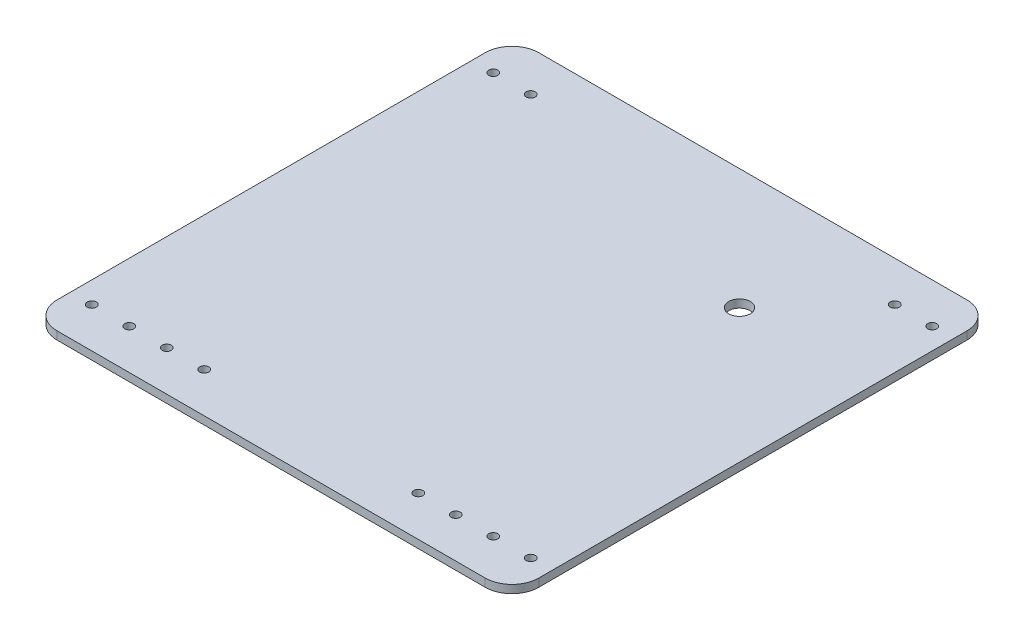
ISO-10303-21;
HEADER;
FILE_DESCRIPTION(('STEP AP214'),'2;1');
FILE_NAME('part.step','',(''),(''),'','','');
FILE_SCHEMA(('AUTOMOTIVE_DESIGN { 1 0 10303 214 1 1 1 1 }'));
ENDSEC;
DATA;
#1=APPLICATION_CONTEXT('core data for automotive mechanical design processes');
#2=APPLICATION_PROTOCOL_DEFINITION('international standard','automotive_design',2000,#1);
#3=PRODUCT_CONTEXT('',#1,'mechanical');
#4=PRODUCT('Part','Part','',(#3));
#5=PRODUCT_RELATED_PRODUCT_CATEGORY('part','',(#4));
#6=PRODUCT_DEFINITION_FORMATION('','',#4);
#7=PRODUCT_DEFINITION_CONTEXT('part definition',#1,'design');
#8=PRODUCT_DEFINITION('design','',#6,#7);
#9=PRODUCT_DEFINITION_SHAPE('','',#8);
#10=(LENGTH_UNIT() NAMED_UNIT(*) SI_UNIT(.MILLI.,.METRE.));
#11=(NAMED_UNIT(*) PLANE_ANGLE_UNIT() SI_UNIT($,.RADIAN.));
#12=(NAMED_UNIT(*) SI_UNIT($,.STERADIAN.) SOLID_ANGLE_UNIT());
#13=UNCERTAINTY_MEASURE_WITH_UNIT(LENGTH_MEASURE(1.E-05),#10,'distance_accuracy_value','');
#14=(GEOMETRIC_REPRESENTATION_CONTEXT(3) GLOBAL_UNCERTAINTY_ASSIGNED_CONTEXT((#13)) GLOBAL_UNIT_ASSIGNED_CONTEXT((#10,
#11,#12)) REPRESENTATION_CONTEXT('',''));
#15=CARTESIAN_POINT('',(0.,0.,0.));
#16=DIRECTION('',(0.,0.,1.));
#17=DIRECTION('',(1.,0.,0.));
#18=AXIS2_PLACEMENT_3D('',#15,#16,#17);
#19=CARTESIAN_POINT('',(90.,3.,-90.));
#20=DIRECTION('',(-1.,0.,0.));
#21=DIRECTION('',(0.,0.,1.));
#22=AXIS2_PLACEMENT_3D('',#19,#20,#21);
#23=PLANE('',#22);
#24=DIRECTION('',(0.,0.,-1.));
#25=VECTOR('',#24,1.);
#26=CARTESIAN_POINT('',(90.,0.,-90.));
#27=LINE('',#26,#25);
#28=CARTESIAN_POINT('',(90.,0.,79.9999999999999));
#29=VERTEX_POINT('',#28);
#30=CARTESIAN_POINT('',(90.,0.,-80.));
#31=VERTEX_POINT('',#30);
#32=EDGE_CURVE('E129',#29,#31,#27,.T.);
#33=ORIENTED_EDGE('',*,*,#32,.T.);
#34=DIRECTION('',(0.,-1.,0.));
#35=VECTOR('',#34,1.);
#36=CARTESIAN_POINT('',(90.,3.,-80.));
#37=LINE('',#36,#35);
#38=CARTESIAN_POINT('',(90.,3.,-80.));
#39=VERTEX_POINT('',#38);
#40=EDGE_CURVE('E11',#31,#39,#37,.F.);
#41=ORIENTED_EDGE('',*,*,#40,.T.);
#42=DIRECTION('',(0.,0.,-1.));
#43=VECTOR('',#42,1.);
#44=CARTESIAN_POINT('',(90.,3.,-90.));
#45=LINE('',#44,#43);
#46=CARTESIAN_POINT('',(90.,3.,79.9999999999999));
#47=VERTEX_POINT('',#46);
#48=EDGE_CURVE('E127',#47,#39,#45,.T.);
#49=ORIENTED_EDGE('',*,*,#48,.F.);
#50=DIRECTION('',(0.,-1.,0.));
#51=VECTOR('',#50,1.);
#52=CARTESIAN_POINT('',(90.,3.,80.));
#53=LINE('',#52,#51);
#54=EDGE_CURVE('E41',#47,#29,#53,.T.);
#55=ORIENTED_EDGE('',*,*,#54,.T.);
#56=EDGE_LOOP('',(#33,#41,#49,#55));
#57=FACE_BOUND('',#56,.T.);
#58=ADVANCED_FACE('F33',(#57),#23,.F.);
#59=CARTESIAN_POINT('',(-90.,3.,-90.));
#60=DIRECTION('',(0.,0.,1.));
#61=DIRECTION('',(1.,0.,0.));
#62=AXIS2_PLACEMENT_3D('',#59,#60,#61);
#63=PLANE('',#62);
#64=DIRECTION('',(-1.,0.,0.));
#65=VECTOR('',#64,1.);
#66=CARTESIAN_POINT('',(-90.,0.,-90.));
#67=LINE('',#66,#65);
#68=CARTESIAN_POINT('',(79.9999999999999,0.,-90.));
#69=VERTEX_POINT('',#68);
#70=CARTESIAN_POINT('',(-80.,0.,-90.));
#71=VERTEX_POINT('',#70);
#72=EDGE_CURVE('E125',#69,#71,#67,.T.);
#73=ORIENTED_EDGE('',*,*,#72,.T.);
#74=DIRECTION('',(0.,-1.,0.));
#75=VECTOR('',#74,1.);
#76=CARTESIAN_POINT('',(-80.,3.,-90.));
#77=LINE('',#76,#75);
#78=CARTESIAN_POINT('',(-80.,3.,-90.));
#79=VERTEX_POINT('',#78);
#80=EDGE_CURVE('E104',#71,#79,#77,.F.);
#81=ORIENTED_EDGE('',*,*,#80,.T.);
#82=DIRECTION('',(-1.,0.,0.));
#83=VECTOR('',#82,1.);
#84=CARTESIAN_POINT('',(-90.,3.,-90.));
#85=LINE('',#84,#83);
#86=CARTESIAN_POINT('',(79.9999999999999,3.,-90.));
#87=VERTEX_POINT('',#86);
#88=EDGE_CURVE('E169',#87,#79,#85,.T.);
#89=ORIENTED_EDGE('',*,*,#88,.F.);
#90=DIRECTION('',(0.,-1.,0.));
#91=VECTOR('',#90,1.);
#92=CARTESIAN_POINT('',(80.,3.,-90.));
#93=LINE('',#92,#91);
#94=EDGE_CURVE('E109',#87,#69,#93,.T.);
#95=ORIENTED_EDGE('',*,*,#94,.T.);
#96=EDGE_LOOP('',(#73,#81,#89,#95));
#97=FACE_BOUND('',#96,.T.);
#98=ADVANCED_FACE('F289',(#97),#63,.F.);
#99=CARTESIAN_POINT('',(-90.,3.,-90.));
#100=DIRECTION('',(1.,0.,0.));
#101=DIRECTION('',(0.,0.,-1.));
#102=AXIS2_PLACEMENT_3D('',#99,#100,#101);
#103=PLANE('',#102);
#104=DIRECTION('',(0.,0.,1.));
#105=VECTOR('',#104,1.);
#106=CARTESIAN_POINT('',(-90.,3.,-90.));
#107=LINE('',#106,#105);
#108=CARTESIAN_POINT('',(-90.,3.,-80.));
#109=VERTEX_POINT('',#108);
#110=CARTESIAN_POINT('',(-90.,3.,79.9999999999999));
#111=VERTEX_POINT('',#110);
#112=EDGE_CURVE('E118',#109,#111,#107,.T.);
#113=ORIENTED_EDGE('',*,*,#112,.F.);
#114=DIRECTION('',(0.,-1.,0.));
#115=VECTOR('',#114,1.);
#116=CARTESIAN_POINT('',(-90.,3.,-80.));
#117=LINE('',#116,#115);
#118=CARTESIAN_POINT('',(-90.,0.,-80.));
#119=VERTEX_POINT('',#118);
#120=EDGE_CURVE('E103',#109,#119,#117,.T.);
#121=ORIENTED_EDGE('',*,*,#120,.T.);
#122=DIRECTION('',(0.,0.,1.));
#123=VECTOR('',#122,1.);
#124=CARTESIAN_POINT('',(-90.,0.,-90.));
#125=LINE('',#124,#123);
#126=CARTESIAN_POINT('',(-90.,0.,79.9999999999999));
#127=VERTEX_POINT('',#126);
#128=EDGE_CURVE('E116',#119,#127,#125,.T.);
#129=ORIENTED_EDGE('',*,*,#128,.T.);
#130=DIRECTION('',(0.,-1.,0.));
#131=VECTOR('',#130,1.);
#132=CARTESIAN_POINT('',(-90.,3.,80.));
#133=LINE('',#132,#131);
#134=EDGE_CURVE('E120',#127,#111,#133,.F.);
#135=ORIENTED_EDGE('',*,*,#134,.T.);
#136=EDGE_LOOP('',(#113,#121,#129,#135));
#137=FACE_BOUND('',#136,.T.);
#138=ADVANCED_FACE('F115',(#137),#103,.F.);
#139=CARTESIAN_POINT('',(-90.,3.,90.));
#140=DIRECTION('',(0.,0.,-1.));
#141=DIRECTION('',(-1.,0.,0.));
#142=AXIS2_PLACEMENT_3D('',#139,#140,#141);
#143=PLANE('',#142);
#144=DIRECTION('',(1.,0.,0.));
#145=VECTOR('',#144,1.);
#146=CARTESIAN_POINT('',(-90.,3.,90.));
#147=LINE('',#146,#145);
#148=CARTESIAN_POINT('',(-80.,3.,90.));
#149=VERTEX_POINT('',#148);
#150=CARTESIAN_POINT('',(79.9999999999999,3.,90.));
#151=VERTEX_POINT('',#150);
#152=EDGE_CURVE('E133',#149,#151,#147,.T.);
#153=ORIENTED_EDGE('',*,*,#152,.F.);
#154=DIRECTION('',(0.,-1.,0.));
#155=VECTOR('',#154,1.);
#156=CARTESIAN_POINT('',(-80.,3.,90.));
#157=LINE('',#156,#155);
#158=CARTESIAN_POINT('',(-80.,0.,90.));
#159=VERTEX_POINT('',#158);
#160=EDGE_CURVE('E150',#149,#159,#157,.T.);
#161=ORIENTED_EDGE('',*,*,#160,.T.);
#162=DIRECTION('',(1.,0.,0.));
#163=VECTOR('',#162,1.);
#164=CARTESIAN_POINT('',(-90.,0.,90.));
#165=LINE('',#164,#163);
#166=CARTESIAN_POINT('',(79.9999999999999,0.,90.));
#167=VERTEX_POINT('',#166);
#168=EDGE_CURVE('E124',#159,#167,#165,.T.);
#169=ORIENTED_EDGE('',*,*,#168,.T.);
#170=DIRECTION('',(0.,-1.,0.));
#171=VECTOR('',#170,1.);
#172=CARTESIAN_POINT('',(80.,3.,90.));
#173=LINE('',#172,#171);
#174=EDGE_CURVE('E48',#167,#151,#173,.F.);
#175=ORIENTED_EDGE('',*,*,#174,.T.);
#176=EDGE_LOOP('',(#153,#161,#169,#175));
#177=FACE_BOUND('',#176,.T.);
#178=ADVANCED_FACE('F260',(#177),#143,.F.);
#179=CARTESIAN_POINT('',(0.,3.,0.));
#180=DIRECTION('',(0.,1.,0.));
#181=DIRECTION('',(0.,0.,1.));
#182=AXIS2_PLACEMENT_3D('',#179,#180,#181);
#183=PLANE('',#182);
#184=CARTESIAN_POINT('',(40.,3.,-45.));
#185=DIRECTION('',(0.,1.,0.));
#186=DIRECTION('',(0.,0.,1.));
#187=AXIS2_PLACEMENT_3D('',#184,#185,#186);
#188=CIRCLE('',#187,4.);
#189=CARTESIAN_POINT('',(40.,3.,-41.));
#190=VERTEX_POINT('',#189);
#191=EDGE_CURVE('E242',#190,#190,#188,.T.);
#192=ORIENTED_EDGE('',*,*,#191,.F.);
#193=EDGE_LOOP('',(#192));
#194=FACE_BOUND('',#193,.T.);
#195=CARTESIAN_POINT('',(-68.,3.,75.));
#196=DIRECTION('',(0.,1.,0.));
#197=DIRECTION('',(0.,0.,1.));
#198=AXIS2_PLACEMENT_3D('',#195,#196,#197);
#199=CIRCLE('',#198,1.70000000000001);
#200=CARTESIAN_POINT('',(-68.,3.,76.7));
#201=VERTEX_POINT('',#200);
#202=EDGE_CURVE('E203',#201,#201,#199,.T.);
#203=ORIENTED_EDGE('',*,*,#202,.F.);
#204=EDGE_LOOP('',(#203));
#205=FACE_BOUND('',#204,.T.);
#206=CARTESIAN_POINT('',(68.,3.,75.));
#207=DIRECTION('',(0.,1.,0.));
#208=DIRECTION('',(0.,0.,1.));
#209=AXIS2_PLACEMENT_3D('',#206,#207,#208);
#210=CIRCLE('',#209,1.70000000000001);
#211=CARTESIAN_POINT('',(68.,3.,76.7));
#212=VERTEX_POINT('',#211);
#213=EDGE_CURVE('E204',#212,#212,#210,.T.);
#214=ORIENTED_EDGE('',*,*,#213,.F.);
#215=EDGE_LOOP('',(#214));
#216=FACE_BOUND('',#215,.T.);
#217=CARTESIAN_POINT('',(82.,3.,75.));
#218=DIRECTION('',(0.,1.,0.));
#219=DIRECTION('',(0.,0.,1.));
#220=AXIS2_PLACEMENT_3D('',#217,#218,#219);
#221=CIRCLE('',#220,1.70000000000001);
#222=CARTESIAN_POINT('',(82.,3.,76.7));
#223=VERTEX_POINT('',#222);
#224=EDGE_CURVE('E215',#223,#223,#221,.T.);
#225=ORIENTED_EDGE('',*,*,#224,.F.);
#226=EDGE_LOOP('',(#225));
#227=FACE_BOUND('',#226,.T.);
#228=CARTESIAN_POINT('',(-54.,3.,75.));
#229=DIRECTION('',(0.,1.,0.));
#230=DIRECTION('',(0.,0.,1.));
#231=AXIS2_PLACEMENT_3D('',#228,#229,#230);
#232=CIRCLE('',#231,1.7);
#233=CARTESIAN_POINT('',(-54.,3.,76.7));
#234=VERTEX_POINT('',#233);
#235=EDGE_CURVE('E216',#234,#234,#232,.T.);
#236=ORIENTED_EDGE('',*,*,#235,.F.);
#237=EDGE_LOOP('',(#236));
#238=FACE_BOUND('',#237,.T.);
#239=CARTESIAN_POINT('',(-68.,3.,-75.));
#240=DIRECTION('',(0.,1.,0.));
#241=DIRECTION('',(0.,0.,1.));
#242=AXIS2_PLACEMENT_3D('',#239,#240,#241);
#243=CIRCLE('',#242,1.70000000000001);
#244=CARTESIAN_POINT('',(-68.,3.,-73.3));
#245=VERTEX_POINT('',#244);
#246=EDGE_CURVE('E179',#245,#245,#243,.T.);
#247=ORIENTED_EDGE('',*,*,#246,.F.);
#248=EDGE_LOOP('',(#247));
#249=FACE_BOUND('',#248,.T.);
#250=CARTESIAN_POINT('',(68.,3.,-75.));
#251=DIRECTION('',(0.,1.,0.));
#252=DIRECTION('',(0.,0.,1.));
#253=AXIS2_PLACEMENT_3D('',#250,#251,#252);
#254=CIRCLE('',#253,1.70000000000001);
#255=CARTESIAN_POINT('',(68.,3.,-73.3));
#256=VERTEX_POINT('',#255);
#257=EDGE_CURVE('E180',#256,#256,#254,.T.);
#258=ORIENTED_EDGE('',*,*,#257,.F.);
#259=EDGE_LOOP('',(#258));
#260=FACE_BOUND('',#259,.T.);
#261=CARTESIAN_POINT('',(82.,3.,-75.));
#262=DIRECTION('',(0.,1.,0.));
#263=DIRECTION('',(0.,0.,1.));
#264=AXIS2_PLACEMENT_3D('',#261,#262,#263);
#265=CIRCLE('',#264,1.70000000000001);
#266=CARTESIAN_POINT('',(82.,3.,-73.3));
#267=VERTEX_POINT('',#266);
#268=EDGE_CURVE('E191',#267,#267,#265,.T.);
#269=ORIENTED_EDGE('',*,*,#268,.F.);
#270=EDGE_LOOP('',(#269));
#271=FACE_BOUND('',#270,.T.);
#272=CARTESIAN_POINT('',(-82.,3.,75.));
#273=DIRECTION('',(0.,1.,0.));
#274=DIRECTION('',(0.,0.,1.));
#275=AXIS2_PLACEMENT_3D('',#272,#273,#274);
#276=CIRCLE('',#275,1.70000000000001);
#277=CARTESIAN_POINT('',(-82.,3.,76.7));
#278=VERTEX_POINT('',#277);
#279=EDGE_CURVE('E192',#278,#278,#276,.T.);
#280=ORIENTED_EDGE('',*,*,#279,.F.);
#281=EDGE_LOOP('',(#280));
#282=FACE_BOUND('',#281,.T.);
#283=CARTESIAN_POINT('',(40.,3.,75.));
#284=DIRECTION('',(0.,1.,0.));
#285=DIRECTION('',(0.,0.,1.));
#286=AXIS2_PLACEMENT_3D('',#283,#284,#285);
#287=CIRCLE('',#286,1.7);
#288=CARTESIAN_POINT('',(40.,3.,76.7));
#289=VERTEX_POINT('',#288);
#290=EDGE_CURVE('E238',#289,#289,#287,.T.);
#291=ORIENTED_EDGE('',*,*,#290,.F.);
#292=EDGE_LOOP('',(#291));
#293=FACE_BOUND('',#292,.T.);
#294=CARTESIAN_POINT('',(-40.,3.,75.));
#295=DIRECTION('',(0.,1.,0.));
#296=DIRECTION('',(0.,0.,1.));
#297=AXIS2_PLACEMENT_3D('',#294,#295,#296);
#298=CIRCLE('',#297,1.7);
#299=CARTESIAN_POINT('',(-40.,3.,76.7));
#300=VERTEX_POINT('',#299);
#301=EDGE_CURVE('E228',#300,#300,#298,.T.);
#302=ORIENTED_EDGE('',*,*,#301,.F.);
#303=EDGE_LOOP('',(#302));
#304=FACE_BOUND('',#303,.T.);
#305=CARTESIAN_POINT('',(54.,3.,75.));
#306=DIRECTION('',(0.,1.,0.));
#307=DIRECTION('',(0.,0.,1.));
#308=AXIS2_PLACEMENT_3D('',#305,#306,#307);
#309=CIRCLE('',#308,1.7);
#310=CARTESIAN_POINT('',(54.,3.,76.7));
#311=VERTEX_POINT('',#310);
#312=EDGE_CURVE('E227',#311,#311,#309,.T.);
#313=ORIENTED_EDGE('',*,*,#312,.F.);
#314=EDGE_LOOP('',(#313));
#315=FACE_BOUND('',#314,.T.);
#316=CARTESIAN_POINT('',(-82.,3.,-75.));
#317=DIRECTION('',(0.,1.,0.));
#318=DIRECTION('',(0.,0.,1.));
#319=AXIS2_PLACEMENT_3D('',#316,#317,#318);
#320=CIRCLE('',#319,1.70000000000001);
#321=CARTESIAN_POINT('',(-82.,3.,-73.3));
#322=VERTEX_POINT('',#321);
#323=EDGE_CURVE('E164',#322,#322,#320,.T.);
#324=ORIENTED_EDGE('',*,*,#323,.F.);
#325=EDGE_LOOP('',(#324));
#326=FACE_BOUND('',#325,.T.);
#327=ORIENTED_EDGE('',*,*,#88,.T.);
#328=CARTESIAN_POINT('',(-80.,3.,-80.));
#329=DIRECTION('',(0.,1.,0.));
#330=DIRECTION('',(0.,0.,1.));
#331=AXIS2_PLACEMENT_3D('',#328,#329,#330);
#332=CIRCLE('',#331,10.);
#333=EDGE_CURVE('E147',#79,#109,#332,.T.);
#334=ORIENTED_EDGE('',*,*,#333,.T.);
#335=ORIENTED_EDGE('',*,*,#112,.T.);
#336=CARTESIAN_POINT('',(-80.,3.,80.));
#337=DIRECTION('',(0.,1.,0.));
#338=DIRECTION('',(0.,0.,1.));
#339=AXIS2_PLACEMENT_3D('',#336,#337,#338);
#340=CIRCLE('',#339,10.);
#341=EDGE_CURVE('E55',#111,#149,#340,.T.);
#342=ORIENTED_EDGE('',*,*,#341,.T.);
#343=ORIENTED_EDGE('',*,*,#152,.T.);
#344=CARTESIAN_POINT('',(80.,3.,80.));
#345=DIRECTION('',(0.,1.,0.));
#346=DIRECTION('',(0.,0.,1.));
#347=AXIS2_PLACEMENT_3D('',#344,#345,#346);
#348=CIRCLE('',#347,10.);
#349=EDGE_CURVE('E142',#151,#47,#348,.T.);
#350=ORIENTED_EDGE('',*,*,#349,.T.);
#351=ORIENTED_EDGE('',*,*,#48,.T.);
#352=CARTESIAN_POINT('',(80.,3.,-80.));
#353=DIRECTION('',(0.,1.,0.));
#354=DIRECTION('',(0.,0.,1.));
#355=AXIS2_PLACEMENT_3D('',#352,#353,#354);
#356=CIRCLE('',#355,10.);
#357=EDGE_CURVE('E144',#39,#87,#356,.T.);
#358=ORIENTED_EDGE('',*,*,#357,.T.);
#359=EDGE_LOOP('',(#327,#334,#335,#342,#343,#350,#351,#358));
#360=FACE_BOUND('',#359,.T.);
#361=ADVANCED_FACE('F257',(#194,#205,#216,#227,#238,#249,#260,#271,#282,#293,#304,#315,#326,
#360),#183,.T.);
#362=CARTESIAN_POINT('',(0.,0.,0.));
#363=DIRECTION('',(0.,1.,0.));
#364=DIRECTION('',(0.,0.,1.));
#365=AXIS2_PLACEMENT_3D('',#362,#363,#364);
#366=PLANE('',#365);
#367=CARTESIAN_POINT('',(40.,0.,-45.));
#368=DIRECTION('',(0.,1.,0.));
#369=DIRECTION('',(0.,0.,1.));
#370=AXIS2_PLACEMENT_3D('',#367,#368,#369);
#371=CIRCLE('',#370,4.);
#372=CARTESIAN_POINT('',(40.,0.,-41.));
#373=VERTEX_POINT('',#372);
#374=EDGE_CURVE('E241',#373,#373,#371,.T.);
#375=ORIENTED_EDGE('',*,*,#374,.T.);
#376=EDGE_LOOP('',(#375));
#377=FACE_BOUND('',#376,.T.);
#378=CARTESIAN_POINT('',(-68.,0.,75.));
#379=DIRECTION('',(0.,1.,0.));
#380=DIRECTION('',(0.,0.,1.));
#381=AXIS2_PLACEMENT_3D('',#378,#379,#380);
#382=CIRCLE('',#381,1.70000000000001);
#383=CARTESIAN_POINT('',(-68.,0.,76.7));
#384=VERTEX_POINT('',#383);
#385=EDGE_CURVE('E195',#384,#384,#382,.F.);
#386=ORIENTED_EDGE('',*,*,#385,.F.);
#387=EDGE_LOOP('',(#386));
#388=FACE_BOUND('',#387,.T.);
#389=CARTESIAN_POINT('',(68.,0.,75.));
#390=DIRECTION('',(0.,1.,0.));
#391=DIRECTION('',(0.,0.,1.));
#392=AXIS2_PLACEMENT_3D('',#389,#390,#391);
#393=CIRCLE('',#392,1.70000000000001);
#394=CARTESIAN_POINT('',(68.,0.,76.7));
#395=VERTEX_POINT('',#394);
#396=EDGE_CURVE('E200',#395,#395,#393,.F.);
#397=ORIENTED_EDGE('',*,*,#396,.F.);
#398=EDGE_LOOP('',(#397));
#399=FACE_BOUND('',#398,.T.);
#400=CARTESIAN_POINT('',(82.,0.,75.));
#401=DIRECTION('',(0.,1.,0.));
#402=DIRECTION('',(0.,0.,1.));
#403=AXIS2_PLACEMENT_3D('',#400,#401,#402);
#404=CIRCLE('',#403,1.70000000000001);
#405=CARTESIAN_POINT('',(82.,0.,76.7));
#406=VERTEX_POINT('',#405);
#407=EDGE_CURVE('E207',#406,#406,#404,.F.);
#408=ORIENTED_EDGE('',*,*,#407,.F.);
#409=EDGE_LOOP('',(#408));
#410=FACE_BOUND('',#409,.T.);
#411=CARTESIAN_POINT('',(-54.,0.,75.));
#412=DIRECTION('',(0.,1.,0.));
#413=DIRECTION('',(0.,0.,1.));
#414=AXIS2_PLACEMENT_3D('',#411,#412,#413);
#415=CIRCLE('',#414,1.7);
#416=CARTESIAN_POINT('',(-54.,0.,76.7));
#417=VERTEX_POINT('',#416);
#418=EDGE_CURVE('E212',#417,#417,#415,.F.);
#419=ORIENTED_EDGE('',*,*,#418,.F.);
#420=EDGE_LOOP('',(#419));
#421=FACE_BOUND('',#420,.T.);
#422=CARTESIAN_POINT('',(-68.,0.,-75.));
#423=DIRECTION('',(0.,1.,0.));
#424=DIRECTION('',(0.,0.,1.));
#425=AXIS2_PLACEMENT_3D('',#422,#423,#424);
#426=CIRCLE('',#425,1.70000000000001);
#427=CARTESIAN_POINT('',(-68.,0.,-73.3));
#428=VERTEX_POINT('',#427);
#429=EDGE_CURVE('E175',#428,#428,#426,.F.);
#430=ORIENTED_EDGE('',*,*,#429,.F.);
#431=EDGE_LOOP('',(#430));
#432=FACE_BOUND('',#431,.T.);
#433=CARTESIAN_POINT('',(68.,0.,-75.));
#434=DIRECTION('',(0.,1.,0.));
#435=DIRECTION('',(0.,0.,1.));
#436=AXIS2_PLACEMENT_3D('',#433,#434,#435);
#437=CIRCLE('',#436,1.70000000000001);
#438=CARTESIAN_POINT('',(68.,0.,-73.3));
#439=VERTEX_POINT('',#438);
#440=EDGE_CURVE('E176',#439,#439,#437,.F.);
#441=ORIENTED_EDGE('',*,*,#440,.F.);
#442=EDGE_LOOP('',(#441));
#443=FACE_BOUND('',#442,.T.);
#444=CARTESIAN_POINT('',(82.,0.,-75.));
#445=DIRECTION('',(0.,1.,0.));
#446=DIRECTION('',(0.,0.,1.));
#447=AXIS2_PLACEMENT_3D('',#444,#445,#446);
#448=CIRCLE('',#447,1.70000000000001);
#449=CARTESIAN_POINT('',(82.,0.,-73.3));
#450=VERTEX_POINT('',#449);
#451=EDGE_CURVE('E183',#450,#450,#448,.F.);
#452=ORIENTED_EDGE('',*,*,#451,.F.);
#453=EDGE_LOOP('',(#452));
#454=FACE_BOUND('',#453,.T.);
#455=CARTESIAN_POINT('',(-82.,0.,75.));
#456=DIRECTION('',(0.,1.,0.));
#457=DIRECTION('',(0.,0.,1.));
#458=AXIS2_PLACEMENT_3D('',#455,#456,#457);
#459=CIRCLE('',#458,1.70000000000001);
#460=CARTESIAN_POINT('',(-82.,0.,76.7));
#461=VERTEX_POINT('',#460);
#462=EDGE_CURVE('E188',#461,#461,#459,.F.);
#463=ORIENTED_EDGE('',*,*,#462,.F.);
#464=EDGE_LOOP('',(#463));
#465=FACE_BOUND('',#464,.T.);
#466=CARTESIAN_POINT('',(40.,0.,75.));
#467=DIRECTION('',(0.,1.,0.));
#468=DIRECTION('',(0.,0.,1.));
#469=AXIS2_PLACEMENT_3D('',#466,#467,#468);
#470=CIRCLE('',#469,1.7);
#471=CARTESIAN_POINT('',(40.,0.,76.7));
#472=VERTEX_POINT('',#471);
#473=EDGE_CURVE('E231',#472,#472,#470,.F.);
#474=ORIENTED_EDGE('',*,*,#473,.F.);
#475=EDGE_LOOP('',(#474));
#476=FACE_BOUND('',#475,.T.);
#477=CARTESIAN_POINT('',(-40.,0.,75.));
#478=DIRECTION('',(0.,1.,0.));
#479=DIRECTION('',(0.,0.,1.));
#480=AXIS2_PLACEMENT_3D('',#477,#478,#479);
#481=CIRCLE('',#480,1.7);
#482=CARTESIAN_POINT('',(-40.,0.,76.7));
#483=VERTEX_POINT('',#482);
#484=EDGE_CURVE('E224',#483,#483,#481,.F.);
#485=ORIENTED_EDGE('',*,*,#484,.F.);
#486=EDGE_LOOP('',(#485));
#487=FACE_BOUND('',#486,.T.);
#488=CARTESIAN_POINT('',(54.,0.,75.));
#489=DIRECTION('',(0.,1.,0.));
#490=DIRECTION('',(0.,0.,1.));
#491=AXIS2_PLACEMENT_3D('',#488,#489,#490);
#492=CIRCLE('',#491,1.7);
#493=CARTESIAN_POINT('',(54.,0.,76.7));
#494=VERTEX_POINT('',#493);
#495=EDGE_CURVE('E219',#494,#494,#492,.F.);
#496=ORIENTED_EDGE('',*,*,#495,.F.);
#497=EDGE_LOOP('',(#496));
#498=FACE_BOUND('',#497,.T.);
#499=CARTESIAN_POINT('',(-82.,0.,-75.));
#500=DIRECTION('',(0.,1.,0.));
#501=DIRECTION('',(0.,0.,1.));
#502=AXIS2_PLACEMENT_3D('',#499,#500,#501);
#503=CIRCLE('',#502,1.70000000000001);
#504=CARTESIAN_POINT('',(-82.,0.,-73.3));
#505=VERTEX_POINT('',#504);
#506=EDGE_CURVE('E162',#505,#505,#503,.F.);
#507=ORIENTED_EDGE('',*,*,#506,.F.);
#508=EDGE_LOOP('',(#507));
#509=FACE_BOUND('',#508,.T.);
#510=ORIENTED_EDGE('',*,*,#128,.F.);
#511=CARTESIAN_POINT('',(-80.,0.,-80.));
#512=DIRECTION('',(0.,1.,0.));
#513=DIRECTION('',(0.,0.,1.));
#514=AXIS2_PLACEMENT_3D('',#511,#512,#513);
#515=CIRCLE('',#514,10.);
#516=EDGE_CURVE('E99',#119,#71,#515,.F.);
#517=ORIENTED_EDGE('',*,*,#516,.T.);
#518=ORIENTED_EDGE('',*,*,#72,.F.);
#519=CARTESIAN_POINT('',(80.,0.,-80.));
#520=DIRECTION('',(0.,1.,0.));
#521=DIRECTION('',(0.,0.,1.));
#522=AXIS2_PLACEMENT_3D('',#519,#520,#521);
#523=CIRCLE('',#522,10.);
#524=EDGE_CURVE('E136',#69,#31,#523,.F.);
#525=ORIENTED_EDGE('',*,*,#524,.T.);
#526=ORIENTED_EDGE('',*,*,#32,.F.);
#527=CARTESIAN_POINT('',(80.,0.,80.));
#528=DIRECTION('',(0.,1.,0.));
#529=DIRECTION('',(0.,0.,1.));
#530=AXIS2_PLACEMENT_3D('',#527,#528,#529);
#531=CIRCLE('',#530,10.);
#532=EDGE_CURVE('E119',#29,#167,#531,.F.);
#533=ORIENTED_EDGE('',*,*,#532,.T.);
#534=ORIENTED_EDGE('',*,*,#168,.F.);
#535=CARTESIAN_POINT('',(-80.,0.,80.));
#536=DIRECTION('',(0.,1.,0.));
#537=DIRECTION('',(0.,0.,1.));
#538=AXIS2_PLACEMENT_3D('',#535,#536,#537);
#539=CIRCLE('',#538,10.);
#540=EDGE_CURVE('E110',#159,#127,#539,.F.);
#541=ORIENTED_EDGE('',*,*,#540,.T.);
#542=EDGE_LOOP('',(#510,#517,#518,#525,#526,#533,#534,#541));
#543=FACE_BOUND('',#542,.T.);
#544=ADVANCED_FACE('F122',(#377,#388,#399,#410,#421,#432,#443,#454,#465,#476,#487,#498,#509,
#543),#366,.F.);
#545=CARTESIAN_POINT('',(-80.,3.,-80.));
#546=DIRECTION('',(0.,-1.,0.));
#547=DIRECTION('',(0.,0.,-1.));
#548=AXIS2_PLACEMENT_3D('',#545,#546,#547);
#549=CYLINDRICAL_SURFACE('',#548,10.);
#550=ORIENTED_EDGE('',*,*,#333,.F.);
#551=ORIENTED_EDGE('',*,*,#80,.F.);
#552=ORIENTED_EDGE('',*,*,#516,.F.);
#553=ORIENTED_EDGE('',*,*,#120,.F.);
#554=EDGE_LOOP('',(#550,#551,#552,#553));
#555=FACE_BOUND('',#554,.T.);
#556=ADVANCED_FACE('F102',(#555),#549,.T.);
#557=CARTESIAN_POINT('',(-80.,3.,80.));
#558=DIRECTION('',(0.,-1.,0.));
#559=DIRECTION('',(0.,0.,-1.));
#560=AXIS2_PLACEMENT_3D('',#557,#558,#559);
#561=CYLINDRICAL_SURFACE('',#560,10.);
#562=ORIENTED_EDGE('',*,*,#341,.F.);
#563=ORIENTED_EDGE('',*,*,#134,.F.);
#564=ORIENTED_EDGE('',*,*,#540,.F.);
#565=ORIENTED_EDGE('',*,*,#160,.F.);
#566=EDGE_LOOP('',(#562,#563,#564,#565));
#567=FACE_BOUND('',#566,.T.);
#568=ADVANCED_FACE('F301',(#567),#561,.T.);
#569=CARTESIAN_POINT('',(80.,3.,-80.));
#570=DIRECTION('',(0.,-1.,0.));
#571=DIRECTION('',(0.,0.,-1.));
#572=AXIS2_PLACEMENT_3D('',#569,#570,#571);
#573=CYLINDRICAL_SURFACE('',#572,10.);
#574=ORIENTED_EDGE('',*,*,#357,.F.);
#575=ORIENTED_EDGE('',*,*,#40,.F.);
#576=ORIENTED_EDGE('',*,*,#524,.F.);
#577=ORIENTED_EDGE('',*,*,#94,.F.);
#578=EDGE_LOOP('',(#574,#575,#576,#577));
#579=FACE_BOUND('',#578,.T.);
#580=ADVANCED_FACE('F291',(#579),#573,.T.);
#581=CARTESIAN_POINT('',(80.,3.,80.));
#582=DIRECTION('',(0.,-1.,0.));
#583=DIRECTION('',(0.,0.,-1.));
#584=AXIS2_PLACEMENT_3D('',#581,#582,#583);
#585=CYLINDRICAL_SURFACE('',#584,10.);
#586=ORIENTED_EDGE('',*,*,#349,.F.);
#587=ORIENTED_EDGE('',*,*,#174,.F.);
#588=ORIENTED_EDGE('',*,*,#532,.F.);
#589=ORIENTED_EDGE('',*,*,#54,.F.);
#590=EDGE_LOOP('',(#586,#587,#588,#589));
#591=FACE_BOUND('',#590,.T.);
#592=ADVANCED_FACE('F35',(#591),#585,.T.);
#593=CARTESIAN_POINT('',(-82.,-4.80832611206858,-75.));
#594=DIRECTION('',(0.,1.,0.));
#595=DIRECTION('',(0.,0.,1.));
#596=AXIS2_PLACEMENT_3D('',#593,#594,#595);
#597=CYLINDRICAL_SURFACE('',#596,1.70000000000001);
#598=ORIENTED_EDGE('',*,*,#506,.T.);
#599=EDGE_LOOP('',(#598));
#600=FACE_BOUND('',#599,.T.);
#601=ORIENTED_EDGE('',*,*,#323,.T.);
#602=EDGE_LOOP('',(#601));
#603=FACE_BOUND('',#602,.T.);
#604=ADVANCED_FACE('F293',(#600,#603),#597,.F.);
#605=CARTESIAN_POINT('',(54.,-4.80832611206858,75.));
#606=DIRECTION('',(0.,1.,0.));
#607=DIRECTION('',(0.,0.,1.));
#608=AXIS2_PLACEMENT_3D('',#605,#606,#607);
#609=CYLINDRICAL_SURFACE('',#608,1.7);
#610=ORIENTED_EDGE('',*,*,#495,.T.);
#611=EDGE_LOOP('',(#610));
#612=FACE_BOUND('',#611,.T.);
#613=ORIENTED_EDGE('',*,*,#312,.T.);
#614=EDGE_LOOP('',(#613));
#615=FACE_BOUND('',#614,.T.);
#616=ADVANCED_FACE('F298',(#612,#615),#609,.F.);
#617=CARTESIAN_POINT('',(-40.,-4.80832611206858,75.));
#618=DIRECTION('',(0.,1.,0.));
#619=DIRECTION('',(0.,0.,1.));
#620=AXIS2_PLACEMENT_3D('',#617,#618,#619);
#621=CYLINDRICAL_SURFACE('',#620,1.7);
#622=ORIENTED_EDGE('',*,*,#484,.T.);
#623=EDGE_LOOP('',(#622));
#624=FACE_BOUND('',#623,.T.);
#625=ORIENTED_EDGE('',*,*,#301,.T.);
#626=EDGE_LOOP('',(#625));
#627=FACE_BOUND('',#626,.T.);
#628=ADVANCED_FACE('F358',(#624,#627),#621,.F.);
#629=CARTESIAN_POINT('',(40.,-4.80832611206858,75.));
#630=DIRECTION('',(0.,1.,0.));
#631=DIRECTION('',(0.,0.,1.));
#632=AXIS2_PLACEMENT_3D('',#629,#630,#631);
#633=CYLINDRICAL_SURFACE('',#632,1.7);
#634=ORIENTED_EDGE('',*,*,#473,.T.);
#635=EDGE_LOOP('',(#634));
#636=FACE_BOUND('',#635,.T.);
#637=ORIENTED_EDGE('',*,*,#290,.T.);
#638=EDGE_LOOP('',(#637));
#639=FACE_BOUND('',#638,.T.);
#640=ADVANCED_FACE('F339',(#636,#639),#633,.F.);
#641=CARTESIAN_POINT('',(-82.,-4.80832611206858,75.));
#642=DIRECTION('',(0.,1.,0.));
#643=DIRECTION('',(0.,0.,1.));
#644=AXIS2_PLACEMENT_3D('',#641,#642,#643);
#645=CYLINDRICAL_SURFACE('',#644,1.70000000000001);
#646=ORIENTED_EDGE('',*,*,#462,.T.);
#647=EDGE_LOOP('',(#646));
#648=FACE_BOUND('',#647,.T.);
#649=ORIENTED_EDGE('',*,*,#279,.T.);
#650=EDGE_LOOP('',(#649));
#651=FACE_BOUND('',#650,.T.);
#652=ADVANCED_FACE('F336',(#648,#651),#645,.F.);
#653=CARTESIAN_POINT('',(82.,-4.80832611206858,-75.));
#654=DIRECTION('',(0.,1.,0.));
#655=DIRECTION('',(0.,0.,1.));
#656=AXIS2_PLACEMENT_3D('',#653,#654,#655);
#657=CYLINDRICAL_SURFACE('',#656,1.70000000000001);
#658=ORIENTED_EDGE('',*,*,#451,.T.);
#659=EDGE_LOOP('',(#658));
#660=FACE_BOUND('',#659,.T.);
#661=ORIENTED_EDGE('',*,*,#268,.T.);
#662=EDGE_LOOP('',(#661));
#663=FACE_BOUND('',#662,.T.);
#664=ADVANCED_FACE('F330',(#660,#663),#657,.F.);
#665=CARTESIAN_POINT('',(68.,-4.80832611206858,-75.));
#666=DIRECTION('',(0.,1.,0.));
#667=DIRECTION('',(0.,0.,1.));
#668=AXIS2_PLACEMENT_3D('',#665,#666,#667);
#669=CYLINDRICAL_SURFACE('',#668,1.70000000000001);
#670=ORIENTED_EDGE('',*,*,#440,.T.);
#671=EDGE_LOOP('',(#670));
#672=FACE_BOUND('',#671,.T.);
#673=ORIENTED_EDGE('',*,*,#257,.T.);
#674=EDGE_LOOP('',(#673));
#675=FACE_BOUND('',#674,.T.);
#676=ADVANCED_FACE('F326',(#672,#675),#669,.F.);
#677=CARTESIAN_POINT('',(-68.,-4.80832611206858,-75.));
#678=DIRECTION('',(0.,1.,0.));
#679=DIRECTION('',(0.,0.,1.));
#680=AXIS2_PLACEMENT_3D('',#677,#678,#679);
#681=CYLINDRICAL_SURFACE('',#680,1.70000000000001);
#682=ORIENTED_EDGE('',*,*,#429,.T.);
#683=EDGE_LOOP('',(#682));
#684=FACE_BOUND('',#683,.T.);
#685=ORIENTED_EDGE('',*,*,#246,.T.);
#686=EDGE_LOOP('',(#685));
#687=FACE_BOUND('',#686,.T.);
#688=ADVANCED_FACE('F329',(#684,#687),#681,.F.);
#689=CARTESIAN_POINT('',(-54.,-4.80832611206858,75.));
#690=DIRECTION('',(0.,1.,0.));
#691=DIRECTION('',(0.,0.,1.));
#692=AXIS2_PLACEMENT_3D('',#689,#690,#691);
#693=CYLINDRICAL_SURFACE('',#692,1.7);
#694=ORIENTED_EDGE('',*,*,#418,.T.);
#695=EDGE_LOOP('',(#694));
#696=FACE_BOUND('',#695,.T.);
#697=ORIENTED_EDGE('',*,*,#235,.T.);
#698=EDGE_LOOP('',(#697));
#699=FACE_BOUND('',#698,.T.);
#700=ADVANCED_FACE('F334',(#696,#699),#693,.F.);
#701=CARTESIAN_POINT('',(82.,-4.80832611206858,75.));
#702=DIRECTION('',(0.,1.,0.));
#703=DIRECTION('',(0.,0.,1.));
#704=AXIS2_PLACEMENT_3D('',#701,#702,#703);
#705=CYLINDRICAL_SURFACE('',#704,1.70000000000001);
#706=ORIENTED_EDGE('',*,*,#407,.T.);
#707=EDGE_LOOP('',(#706));
#708=FACE_BOUND('',#707,.T.);
#709=ORIENTED_EDGE('',*,*,#224,.T.);
#710=EDGE_LOOP('',(#709));
#711=FACE_BOUND('',#710,.T.);
#712=ADVANCED_FACE('F347',(#708,#711),#705,.F.);
#713=CARTESIAN_POINT('',(68.,-4.80832611206858,75.));
#714=DIRECTION('',(0.,1.,0.));
#715=DIRECTION('',(0.,0.,1.));
#716=AXIS2_PLACEMENT_3D('',#713,#714,#715);
#717=CYLINDRICAL_SURFACE('',#716,1.70000000000001);
#718=ORIENTED_EDGE('',*,*,#396,.T.);
#719=EDGE_LOOP('',(#718));
#720=FACE_BOUND('',#719,.T.);
#721=ORIENTED_EDGE('',*,*,#213,.T.);
#722=EDGE_LOOP('',(#721));
#723=FACE_BOUND('',#722,.T.);
#724=ADVANCED_FACE('F344',(#720,#723),#717,.F.);
#725=CARTESIAN_POINT('',(-68.,-4.80832611206858,75.));
#726=DIRECTION('',(0.,1.,0.));
#727=DIRECTION('',(0.,0.,1.));
#728=AXIS2_PLACEMENT_3D('',#725,#726,#727);
#729=CYLINDRICAL_SURFACE('',#728,1.70000000000001);
#730=ORIENTED_EDGE('',*,*,#385,.T.);
#731=EDGE_LOOP('',(#730));
#732=FACE_BOUND('',#731,.T.);
#733=ORIENTED_EDGE('',*,*,#202,.T.);
#734=EDGE_LOOP('',(#733));
#735=FACE_BOUND('',#734,.T.);
#736=ADVANCED_FACE('F253',(#732,#735),#729,.F.);
#737=CARTESIAN_POINT('',(40.,0.,-45.));
#738=DIRECTION('',(0.,1.,0.));
#739=DIRECTION('',(0.,0.,1.));
#740=AXIS2_PLACEMENT_3D('',#737,#738,#739);
#741=CYLINDRICAL_SURFACE('',#740,4.);
#742=ORIENTED_EDGE('',*,*,#374,.F.);
#743=EDGE_LOOP('',(#742));
#744=FACE_BOUND('',#743,.T.);
#745=ORIENTED_EDGE('',*,*,#191,.T.);
#746=EDGE_LOOP('',(#745));
#747=FACE_BOUND('',#746,.T.);
#748=ADVANCED_FACE('F250',(#744,#747),#741,.F.);
#749=CLOSED_SHELL('',(#58,#98,#138,#178,#361,#544,#556,#568,#580,#592,#604,#616,#628,#640,#652,
#664,#676,#688,#700,#712,#724,#736,#748));
#750=MANIFOLD_SOLID_BREP('B2',#749);
#751=ADVANCED_BREP_SHAPE_REPRESENTATION('',(#18,#750),#14);
#752=SHAPE_DEFINITION_REPRESENTATION(#9,#751);
ENDSEC;
END-ISO-10303-21;
